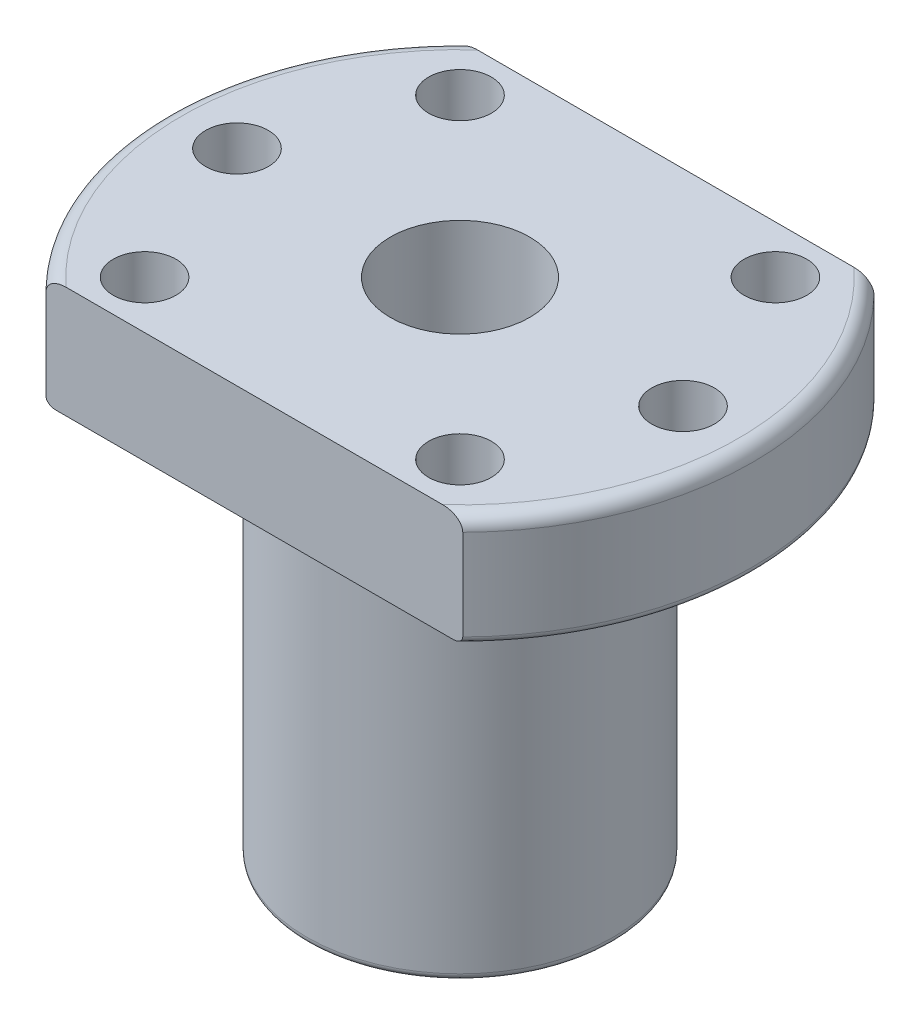
ISO-10303-21;
HEADER;
FILE_DESCRIPTION(('STEP AP214'),'2;1');
FILE_NAME('part.step','',(''),(''),'','','');
FILE_SCHEMA(('AUTOMOTIVE_DESIGN { 1 0 10303 214 1 1 1 1 }'));
ENDSEC;
DATA;
#1=APPLICATION_CONTEXT('core data for automotive mechanical design processes');
#2=APPLICATION_PROTOCOL_DEFINITION('international standard','automotive_design',2000,#1);
#3=PRODUCT_CONTEXT('',#1,'mechanical');
#4=PRODUCT('Part','Part','',(#3));
#5=PRODUCT_RELATED_PRODUCT_CATEGORY('part','',(#4));
#6=PRODUCT_DEFINITION_FORMATION('','',#4);
#7=PRODUCT_DEFINITION_CONTEXT('part definition',#1,'design');
#8=PRODUCT_DEFINITION('design','',#6,#7);
#9=PRODUCT_DEFINITION_SHAPE('','',#8);
#10=(LENGTH_UNIT() NAMED_UNIT(*) SI_UNIT(.MILLI.,.METRE.));
#11=(NAMED_UNIT(*) PLANE_ANGLE_UNIT() SI_UNIT($,.RADIAN.));
#12=(NAMED_UNIT(*) SI_UNIT($,.STERADIAN.) SOLID_ANGLE_UNIT());
#13=UNCERTAINTY_MEASURE_WITH_UNIT(LENGTH_MEASURE(1.E-05),#10,'distance_accuracy_value','');
#14=(GEOMETRIC_REPRESENTATION_CONTEXT(3) GLOBAL_UNCERTAINTY_ASSIGNED_CONTEXT((#13)) GLOBAL_UNIT_ASSIGNED_CONTEXT((#10,
#11,#12)) REPRESENTATION_CONTEXT('',''));
#15=CARTESIAN_POINT('',(0.,0.,0.));
#16=DIRECTION('',(0.,0.,1.));
#17=DIRECTION('',(1.,0.,0.));
#18=AXIS2_PLACEMENT_3D('',#15,#16,#17);
#19=CARTESIAN_POINT('',(0.,0.,0.));
#20=DIRECTION('',(0.,1.,0.));
#21=DIRECTION('',(0.,0.,1.));
#22=AXIS2_PLACEMENT_3D('',#19,#20,#21);
#23=PLANE('',#22);
#24=CARTESIAN_POINT('',(11.3137084989849,0.,11.3137084989846));
#25=DIRECTION('',(0.,1.,0.));
#26=DIRECTION('',(0.,0.,1.));
#27=AXIS2_PLACEMENT_3D('',#24,#25,#26);
#28=CIRCLE('',#27,2.24999999999999);
#29=CARTESIAN_POINT('',(11.3137084989849,0.,13.5637084989846));
#30=VERTEX_POINT('',#29);
#31=EDGE_CURVE('E269',#30,#30,#28,.T.);
#32=ORIENTED_EDGE('',*,*,#31,.T.);
#33=EDGE_LOOP('',(#32));
#34=FACE_BOUND('',#33,.T.);
#35=CARTESIAN_POINT('',(-11.3137084989847,0.,11.3137084989849));
#36=DIRECTION('',(0.,1.,0.));
#37=DIRECTION('',(0.,0.,1.));
#38=AXIS2_PLACEMENT_3D('',#35,#36,#37);
#39=CIRCLE('',#38,2.24999999999999);
#40=CARTESIAN_POINT('',(-11.3137084989847,0.,13.5637084989849));
#41=VERTEX_POINT('',#40);
#42=EDGE_CURVE('E273',#41,#41,#39,.T.);
#43=ORIENTED_EDGE('',*,*,#42,.T.);
#44=EDGE_LOOP('',(#43));
#45=FACE_BOUND('',#44,.T.);
#46=CARTESIAN_POINT('',(-16.,0.,0.));
#47=DIRECTION('',(0.,1.,0.));
#48=DIRECTION('',(0.,0.,1.));
#49=AXIS2_PLACEMENT_3D('',#46,#47,#48);
#50=CIRCLE('',#49,2.24999999999999);
#51=CARTESIAN_POINT('',(-16.,0.,2.24999999999999));
#52=VERTEX_POINT('',#51);
#53=EDGE_CURVE('E159',#52,#52,#50,.T.);
#54=ORIENTED_EDGE('',*,*,#53,.T.);
#55=EDGE_LOOP('',(#54));
#56=FACE_BOUND('',#55,.T.);
#57=CARTESIAN_POINT('',(-11.3137084989848,0.,-11.3137084989847));
#58=DIRECTION('',(0.,1.,0.));
#59=DIRECTION('',(0.,0.,1.));
#60=AXIS2_PLACEMENT_3D('',#57,#58,#59);
#61=CIRCLE('',#60,2.24999999999999);
#62=CARTESIAN_POINT('',(-11.3137084989848,0.,-9.06370849898471));
#63=VERTEX_POINT('',#62);
#64=EDGE_CURVE('E279',#63,#63,#61,.T.);
#65=ORIENTED_EDGE('',*,*,#64,.T.);
#66=EDGE_LOOP('',(#65));
#67=FACE_BOUND('',#66,.T.);
#68=CARTESIAN_POINT('',(11.3137084989847,0.,-11.3137084989848));
#69=DIRECTION('',(0.,1.,0.));
#70=DIRECTION('',(0.,0.,1.));
#71=AXIS2_PLACEMENT_3D('',#68,#69,#70);
#72=CIRCLE('',#71,2.24999999999999);
#73=CARTESIAN_POINT('',(11.3137084989847,0.,-9.06370849898479));
#74=VERTEX_POINT('',#73);
#75=EDGE_CURVE('E283',#74,#74,#72,.T.);
#76=ORIENTED_EDGE('',*,*,#75,.T.);
#77=EDGE_LOOP('',(#76));
#78=FACE_BOUND('',#77,.T.);
#79=CARTESIAN_POINT('',(16.,0.,0.));
#80=DIRECTION('',(0.,1.,0.));
#81=DIRECTION('',(0.,0.,1.));
#82=AXIS2_PLACEMENT_3D('',#79,#80,#81);
#83=CIRCLE('',#82,2.24999999999999);
#84=CARTESIAN_POINT('',(16.,0.,2.24999999999999));
#85=VERTEX_POINT('',#84);
#86=EDGE_CURVE('E154',#85,#85,#83,.T.);
#87=ORIENTED_EDGE('',*,*,#86,.T.);
#88=EDGE_LOOP('',(#87));
#89=FACE_BOUND('',#88,.T.);
#90=DIRECTION('',(-1.,0.,0.));
#91=VECTOR('',#90,1.);
#92=CARTESIAN_POINT('',(-14.9478259288768,0.,-14.75));
#93=LINE('',#92,#91);
#94=CARTESIAN_POINT('',(14.2368360249038,0.,-14.75));
#95=VERTEX_POINT('',#94);
#96=CARTESIAN_POINT('',(-14.2368360249039,0.,-14.75));
#97=VERTEX_POINT('',#96);
#98=EDGE_CURVE('E129',#95,#97,#93,.T.);
#99=ORIENTED_EDGE('',*,*,#98,.F.);
#100=CARTESIAN_POINT('',(0.,0.,0.));
#101=DIRECTION('',(0.,1.,0.));
#102=DIRECTION('',(0.,0.,1.));
#103=AXIS2_PLACEMENT_3D('',#100,#101,#102);
#104=CIRCLE('',#103,20.5);
#105=CARTESIAN_POINT('',(14.2368360249038,0.,14.75));
#106=VERTEX_POINT('',#105);
#107=EDGE_CURVE('E57',#95,#106,#104,.F.);
#108=ORIENTED_EDGE('',*,*,#107,.T.);
#109=DIRECTION('',(1.,0.,0.));
#110=VECTOR('',#109,1.);
#111=CARTESIAN_POINT('',(-14.9478259288767,0.,14.75));
#112=LINE('',#111,#110);
#113=CARTESIAN_POINT('',(-14.2368360249038,0.,14.75));
#114=VERTEX_POINT('',#113);
#115=EDGE_CURVE('E134',#114,#106,#112,.T.);
#116=ORIENTED_EDGE('',*,*,#115,.F.);
#117=CARTESIAN_POINT('',(0.,0.,0.));
#118=DIRECTION('',(0.,1.,0.));
#119=DIRECTION('',(0.,0.,1.));
#120=AXIS2_PLACEMENT_3D('',#117,#118,#119);
#121=CIRCLE('',#120,20.5);
#122=EDGE_CURVE('E469',#114,#97,#121,.F.);
#123=ORIENTED_EDGE('',*,*,#122,.T.);
#124=EDGE_LOOP('',(#99,#108,#116,#123));
#125=FACE_BOUND('',#124,.T.);
#126=CARTESIAN_POINT('',(0.,0.,0.));
#127=DIRECTION('',(0.,1.,0.));
#128=DIRECTION('',(0.,0.,1.));
#129=AXIS2_PLACEMENT_3D('',#126,#127,#128);
#130=CIRCLE('',#129,11.);
#131=CARTESIAN_POINT('',(0.,0.,11.));
#132=VERTEX_POINT('',#131);
#133=EDGE_CURVE('E151',#132,#132,#130,.F.);
#134=ORIENTED_EDGE('',*,*,#133,.F.);
#135=EDGE_LOOP('',(#134));
#136=FACE_BOUND('',#135,.T.);
#137=ADVANCED_FACE('F34',(#34,#45,#56,#67,#78,#89,#125,#136),#23,.F.);
#138=CARTESIAN_POINT('',(0.,8.,0.));
#139=DIRECTION('',(0.,1.,0.));
#140=DIRECTION('',(0.,0.,1.));
#141=AXIS2_PLACEMENT_3D('',#138,#139,#140);
#142=PLANE('',#141);
#143=CARTESIAN_POINT('',(11.3137084989849,8.,11.3137084989846));
#144=DIRECTION('',(0.,1.,0.));
#145=DIRECTION('',(0.,0.,1.));
#146=AXIS2_PLACEMENT_3D('',#143,#144,#145);
#147=CIRCLE('',#146,2.25);
#148=CARTESIAN_POINT('',(11.3137084989849,8.,13.5637084989846));
#149=VERTEX_POINT('',#148);
#150=EDGE_CURVE('E331',#149,#149,#147,.T.);
#151=ORIENTED_EDGE('',*,*,#150,.F.);
#152=EDGE_LOOP('',(#151));
#153=FACE_BOUND('',#152,.T.);
#154=CARTESIAN_POINT('',(-11.3137084989847,8.,11.3137084989849));
#155=DIRECTION('',(0.,1.,0.));
#156=DIRECTION('',(0.,0.,1.));
#157=AXIS2_PLACEMENT_3D('',#154,#155,#156);
#158=CIRCLE('',#157,2.25);
#159=CARTESIAN_POINT('',(-11.3137084989847,8.,13.5637084989849));
#160=VERTEX_POINT('',#159);
#161=EDGE_CURVE('E327',#160,#160,#158,.T.);
#162=ORIENTED_EDGE('',*,*,#161,.F.);
#163=EDGE_LOOP('',(#162));
#164=FACE_BOUND('',#163,.T.);
#165=CARTESIAN_POINT('',(-16.,8.,0.));
#166=DIRECTION('',(0.,1.,0.));
#167=DIRECTION('',(0.,0.,1.));
#168=AXIS2_PLACEMENT_3D('',#165,#166,#167);
#169=CIRCLE('',#168,2.25);
#170=CARTESIAN_POINT('',(-16.,8.,2.25));
#171=VERTEX_POINT('',#170);
#172=EDGE_CURVE('E163',#171,#171,#169,.T.);
#173=ORIENTED_EDGE('',*,*,#172,.F.);
#174=EDGE_LOOP('',(#173));
#175=FACE_BOUND('',#174,.T.);
#176=CARTESIAN_POINT('',(-11.3137084989848,8.,-11.3137084989847));
#177=DIRECTION('',(0.,1.,0.));
#178=DIRECTION('',(0.,0.,1.));
#179=AXIS2_PLACEMENT_3D('',#176,#177,#178);
#180=CIRCLE('',#179,2.25);
#181=CARTESIAN_POINT('',(-11.3137084989848,8.,-9.0637084989847));
#182=VERTEX_POINT('',#181);
#183=EDGE_CURVE('E162',#182,#182,#180,.T.);
#184=ORIENTED_EDGE('',*,*,#183,.F.);
#185=EDGE_LOOP('',(#184));
#186=FACE_BOUND('',#185,.T.);
#187=CARTESIAN_POINT('',(11.3137084989847,8.,-11.3137084989848));
#188=DIRECTION('',(0.,1.,0.));
#189=DIRECTION('',(0.,0.,1.));
#190=AXIS2_PLACEMENT_3D('',#187,#188,#189);
#191=CIRCLE('',#190,2.25);
#192=CARTESIAN_POINT('',(11.3137084989847,8.,-9.06370849898479));
#193=VERTEX_POINT('',#192);
#194=EDGE_CURVE('E318',#193,#193,#191,.T.);
#195=ORIENTED_EDGE('',*,*,#194,.F.);
#196=EDGE_LOOP('',(#195));
#197=FACE_BOUND('',#196,.T.);
#198=CARTESIAN_POINT('',(16.,8.,0.));
#199=DIRECTION('',(0.,1.,0.));
#200=DIRECTION('',(0.,0.,1.));
#201=AXIS2_PLACEMENT_3D('',#198,#199,#200);
#202=CIRCLE('',#201,2.25);
#203=CARTESIAN_POINT('',(16.,8.,2.25));
#204=VERTEX_POINT('',#203);
#205=EDGE_CURVE('E158',#204,#204,#202,.T.);
#206=ORIENTED_EDGE('',*,*,#205,.F.);
#207=EDGE_LOOP('',(#206));
#208=FACE_BOUND('',#207,.T.);
#209=DIRECTION('',(-1.,0.,0.));
#210=VECTOR('',#209,1.);
#211=CARTESIAN_POINT('',(-14.9478259288768,8.,-14.75));
#212=LINE('',#211,#210);
#213=CARTESIAN_POINT('',(13.5069426592401,8.,-14.75));
#214=VERTEX_POINT('',#213);
#215=CARTESIAN_POINT('',(-13.5069426592401,8.,-14.75));
#216=VERTEX_POINT('',#215);
#217=EDGE_CURVE('E123',#214,#216,#212,.T.);
#218=ORIENTED_EDGE('',*,*,#217,.T.);
#219=CARTESIAN_POINT('',(0.,8.,0.));
#220=DIRECTION('',(0.,1.,0.));
#221=DIRECTION('',(0.,0.,1.));
#222=AXIS2_PLACEMENT_3D('',#219,#220,#221);
#223=CIRCLE('',#222,20.);
#224=CARTESIAN_POINT('',(-13.5069426592401,8.,14.75));
#225=VERTEX_POINT('',#224);
#226=EDGE_CURVE('E106',#216,#225,#223,.T.);
#227=ORIENTED_EDGE('',*,*,#226,.T.);
#228=DIRECTION('',(1.,0.,0.));
#229=VECTOR('',#228,1.);
#230=CARTESIAN_POINT('',(-14.9478259288767,8.,14.75));
#231=LINE('',#230,#229);
#232=CARTESIAN_POINT('',(13.5069426592401,8.,14.75));
#233=VERTEX_POINT('',#232);
#234=EDGE_CURVE('E120',#225,#233,#231,.T.);
#235=ORIENTED_EDGE('',*,*,#234,.T.);
#236=CARTESIAN_POINT('',(0.,8.,0.));
#237=DIRECTION('',(0.,1.,0.));
#238=DIRECTION('',(0.,0.,1.));
#239=AXIS2_PLACEMENT_3D('',#236,#237,#238);
#240=CIRCLE('',#239,20.);
#241=EDGE_CURVE('E124',#233,#214,#240,.T.);
#242=ORIENTED_EDGE('',*,*,#241,.T.);
#243=EDGE_LOOP('',(#218,#227,#235,#242));
#244=FACE_BOUND('',#243,.T.);
#245=CARTESIAN_POINT('',(0.,8.,0.));
#246=DIRECTION('',(0.,1.,0.));
#247=DIRECTION('',(0.,0.,1.));
#248=AXIS2_PLACEMENT_3D('',#245,#246,#247);
#249=CIRCLE('',#248,5.);
#250=CARTESIAN_POINT('',(0.,8.,5.));
#251=VERTEX_POINT('',#250);
#252=EDGE_CURVE('E137',#251,#251,#249,.T.);
#253=ORIENTED_EDGE('',*,*,#252,.F.);
#254=EDGE_LOOP('',(#253));
#255=FACE_BOUND('',#254,.T.);
#256=ADVANCED_FACE('F117',(#153,#164,#175,#186,#197,#208,#244,#255),#142,.T.);
#257=CARTESIAN_POINT('',(0.,8.,0.));
#258=DIRECTION('',(0.,-1.,0.));
#259=DIRECTION('',(0.,0.,-1.));
#260=AXIS2_PLACEMENT_3D('',#257,#258,#259);
#261=CYLINDRICAL_SURFACE('',#260,21.);
#262=DIRECTION('',(0.,-1.,0.));
#263=VECTOR('',#262,1.);
#264=CARTESIAN_POINT('',(-14.9478259288768,8.,-14.75));
#265=LINE('',#264,#263);
#266=CARTESIAN_POINT('',(-14.9478259288768,7.,-14.75));
#267=VERTEX_POINT('',#266);
#268=CARTESIAN_POINT('',(-14.9478259288768,0.5,-14.75));
#269=VERTEX_POINT('',#268);
#270=EDGE_CURVE('E131',#267,#269,#265,.T.);
#271=ORIENTED_EDGE('',*,*,#270,.T.);
#272=CARTESIAN_POINT('',(0.,0.5,0.));
#273=DIRECTION('',(0.,1.,0.));
#274=DIRECTION('',(0.,0.,1.));
#275=AXIS2_PLACEMENT_3D('',#272,#273,#274);
#276=CIRCLE('',#275,21.);
#277=CARTESIAN_POINT('',(-14.9478259288767,0.5,14.75));
#278=VERTEX_POINT('',#277);
#279=EDGE_CURVE('E463',#269,#278,#276,.T.);
#280=ORIENTED_EDGE('',*,*,#279,.T.);
#281=DIRECTION('',(0.,-1.,0.));
#282=VECTOR('',#281,1.);
#283=CARTESIAN_POINT('',(-14.9478259288767,8.,14.75));
#284=LINE('',#283,#282);
#285=CARTESIAN_POINT('',(-14.9478259288767,7.,14.75));
#286=VERTEX_POINT('',#285);
#287=EDGE_CURVE('E149',#286,#278,#284,.T.);
#288=ORIENTED_EDGE('',*,*,#287,.F.);
#289=CARTESIAN_POINT('',(0.,7.,0.));
#290=DIRECTION('',(0.,1.,0.));
#291=DIRECTION('',(0.,0.,1.));
#292=AXIS2_PLACEMENT_3D('',#289,#290,#291);
#293=CIRCLE('',#292,21.);
#294=EDGE_CURVE('E107',#286,#267,#293,.F.);
#295=ORIENTED_EDGE('',*,*,#294,.T.);
#296=EDGE_LOOP('',(#271,#280,#288,#295));
#297=FACE_BOUND('',#296,.T.);
#298=ADVANCED_FACE('F185',(#297),#261,.T.);
#299=CARTESIAN_POINT('',(-14.9478259288767,8.,14.75));
#300=DIRECTION('',(0.,0.,-1.));
#301=DIRECTION('',(-1.,0.,0.));
#302=AXIS2_PLACEMENT_3D('',#299,#300,#301);
#303=PLANE('',#302);
#304=ORIENTED_EDGE('',*,*,#115,.T.);
#305=CARTESIAN_POINT('',(14.2368360249038,0.,14.75));
#306=CARTESIAN_POINT('',(14.2645280876522,7.74826244398505E-06,14.75));
#307=CARTESIAN_POINT('',(14.2922022325556,0.00110980537690282,14.75));
#308=CARTESIAN_POINT('',(14.3474137356424,0.00557318697840979,14.75));
#309=CARTESIAN_POINT('',(14.3749507835145,0.00893832747370448,14.75));
#310=CARTESIAN_POINT('',(14.4575537275548,0.0226104335168016,14.75));
#311=CARTESIAN_POINT('',(14.5121091205638,0.0364967933773837,14.75));
#312=CARTESIAN_POINT('',(14.6000347039378,0.0683399200607381,14.75));
#313=CARTESIAN_POINT('',(14.6344555545674,0.0834417867983814,14.75));
#314=CARTESIAN_POINT('',(14.7005566072333,0.118665610743979,14.75));
#315=CARTESIAN_POINT('',(14.7322461478623,0.13876946779952,14.75));
#316=CARTESIAN_POINT('',(14.7841864591707,0.17872568126033,14.75));
#317=CARTESIAN_POINT('',(14.8053296822602,0.197414614826338,14.75));
#318=CARTESIAN_POINT('',(14.8444138601702,0.237918320870485,14.75));
#319=CARTESIAN_POINT('',(14.8623577217982,0.259730223119138,14.75));
#320=CARTESIAN_POINT('',(14.8907827020407,0.301634018545011,14.75));
#321=CARTESIAN_POINT('',(14.9020385678448,0.321198578252392,14.75));
#322=CARTESIAN_POINT('',(14.9211610002851,0.361902253860436,14.75));
#323=CARTESIAN_POINT('',(14.929034829091,0.383037880518841,14.75));
#324=CARTESIAN_POINT('',(14.9391725212027,0.420189491291733,14.75));
#325=CARTESIAN_POINT('',(14.9423957699318,0.435947232752129,14.75));
#326=CARTESIAN_POINT('',(14.9467323883287,0.467797314996761,14.75));
#327=CARTESIAN_POINT('',(14.9478393494616,0.483890523374978,14.75));
#328=CARTESIAN_POINT('',(14.9478259288767,0.500000000000001,14.75));
#329=B_SPLINE_CURVE_WITH_KNOTS('',3,(#305,#306,#307,#308,#309,#310,#311,#312,#313,#314,#315,
#316,#317,#318,#319,#320,#321,#322,#323,#324,#325,#326,#327,#328),.UNSPECIFIED.,.F.,.F.,(4,2,2,
2,2,2,2,2,2,2,2,4),(0.,0.0830158471083474,0.166172027581731,0.333974109747401,0.446408589747027,
0.558441986547342,0.642814394827929,0.727109750806298,0.794559771043547,0.861864224438678,
0.909981085784283,0.958243425070669),.UNSPECIFIED.);
#330=CARTESIAN_POINT('',(14.9478259288767,0.5,14.75));
#331=VERTEX_POINT('',#330);
#332=EDGE_CURVE('E197',#106,#331,#329,.T.);
#333=ORIENTED_EDGE('',*,*,#332,.T.);
#334=DIRECTION('',(0.,-1.,0.));
#335=VECTOR('',#334,1.);
#336=CARTESIAN_POINT('',(14.9478259288767,8.,14.75));
#337=LINE('',#336,#335);
#338=CARTESIAN_POINT('',(14.9478259288767,7.,14.75));
#339=VERTEX_POINT('',#338);
#340=EDGE_CURVE('E146',#339,#331,#337,.T.);
#341=ORIENTED_EDGE('',*,*,#340,.F.);
#342=CARTESIAN_POINT('',(14.9478259288767,7.,14.75));
#343=CARTESIAN_POINT('',(14.9478298476048,7.02242540324757,14.75));
#344=CARTESIAN_POINT('',(14.9467652310037,7.04483718625379,14.75));
#345=CARTESIAN_POINT('',(14.9425458142488,7.08944714242369,14.75));
#346=CARTESIAN_POINT('',(14.9393925337539,7.11164545899603,14.75));
#347=CARTESIAN_POINT('',(14.92694266166,7.17729404582295,14.75));
#348=CARTESIAN_POINT('',(14.9146541231529,7.22020712417751,14.75));
#349=CARTESIAN_POINT('',(14.8830123298779,7.30314928694122,14.75));
#350=CARTESIAN_POINT('',(14.8636770700731,7.34318540910178,14.75));
#351=CARTESIAN_POINT('',(14.8190645113758,7.41986373687077,14.75));
#352=CARTESIAN_POINT('',(14.7937745239565,7.45649845895782,14.75));
#353=CARTESIAN_POINT('',(14.7275887206947,7.53952915307985,14.75));
#354=CARTESIAN_POINT('',(14.6844573889568,7.58414100073959,14.75));
#355=CARTESIAN_POINT('',(14.5916159692135,7.66584381587117,14.75));
#356=CARTESIAN_POINT('',(14.5418951764486,7.70292229146545,14.75));
#357=CARTESIAN_POINT('',(14.4172064658566,7.78319762733565,14.75));
#358=CARTESIAN_POINT('',(14.3400492268914,7.82298394054636,14.75));
#359=CARTESIAN_POINT('',(14.1803588479982,7.88990942831022,14.75));
#360=CARTESIAN_POINT('',(14.0978108317088,7.91701176099371,14.75));
#361=CARTESIAN_POINT('',(13.9307348511282,7.95940979208388,14.75));
#362=CARTESIAN_POINT('',(13.8462386455535,7.97483205744163,14.75));
#363=CARTESIAN_POINT('',(13.7189857764266,7.99003984536936,14.75));
#364=CARTESIAN_POINT('',(13.676656501993,7.99378878567431,14.75));
#365=CARTESIAN_POINT('',(13.5918687310867,7.99876611643036,14.75));
#366=CARTESIAN_POINT('',(13.5494103026378,7.99999565992158,14.75));
#367=CARTESIAN_POINT('',(13.5069426592401,8.,14.75));
#368=B_SPLINE_CURVE_WITH_KNOTS('',3,(#342,#343,#344,#345,#346,#347,#348,#349,#350,#351,#352,
#353,#354,#355,#356,#357,#358,#359,#360,#361,#362,#363,#364,#365,#366,#367),.UNSPECIFIED.,.F.,
.F.,(4,2,2,2,2,2,2,2,2,2,2,2,4),(0.,0.0672251103148741,0.134401362986036,0.267545420235376,
0.4003518276773,0.533443826017013,0.718574937751304,0.90401057347758,1.16302951375484,
1.42279620089204,1.67970607185475,1.80712904910128,1.93449369625466),.UNSPECIFIED.);
#369=EDGE_CURVE('E112',#339,#233,#368,.T.);
#370=ORIENTED_EDGE('',*,*,#369,.T.);
#371=ORIENTED_EDGE('',*,*,#234,.F.);
#372=CARTESIAN_POINT('',(-13.5069426592401,8.,14.75));
#373=CARTESIAN_POINT('',(-13.5645457829032,7.99998715854758,14.75));
#374=CARTESIAN_POINT('',(-13.6221657253092,7.99772872969722,14.75));
#375=CARTESIAN_POINT('',(-13.7371490361235,7.9885243489197,14.75));
#376=CARTESIAN_POINT('',(-13.794511609919,7.98156854717799,14.75));
#377=CARTESIAN_POINT('',(-13.9090857202748,7.9626656888973,14.75));
#378=CARTESIAN_POINT('',(-13.9662882807676,7.9506633042786,14.75));
#379=CARTESIAN_POINT('',(-14.0792763592951,7.92139175471893,14.75));
#380=CARTESIAN_POINT('',(-14.1350632165867,7.90412778502228,14.75));
#381=CARTESIAN_POINT('',(-14.258979270878,7.85871044037686,14.75));
#382=CARTESIAN_POINT('',(-14.3265120504576,7.82888903530641,14.75));
#383=CARTESIAN_POINT('',(-14.4562258644666,7.75956681936739,14.75));
#384=CARTESIAN_POINT('',(-14.5184256598934,7.72010199409377,14.75));
#385=CARTESIAN_POINT('',(-14.6212270415216,7.6412070615916,14.75));
#386=CARTESIAN_POINT('',(-14.6634752037993,7.60393367062402,14.75));
#387=CARTESIAN_POINT('',(-14.741554046878,7.52311377766061,14.75));
#388=CARTESIAN_POINT('',(-14.7773902718622,7.47957275444242,14.75));
#389=CARTESIAN_POINT('',(-14.8341075959526,7.39594360125545,14.75));
#390=CARTESIAN_POINT('',(-14.8565466583308,7.35691559951152,14.75));
#391=CARTESIAN_POINT('',(-14.8946603780237,7.27571920797203,14.75));
#392=CARTESIAN_POINT('',(-14.9103493144342,7.233557670742,14.75));
#393=CARTESIAN_POINT('',(-14.9305637774342,7.15940815478796,14.75));
#394=CARTESIAN_POINT('',(-14.9369944546954,7.12793237915329,14.75));
#395=CARTESIAN_POINT('',(-14.94564492619,7.06431617992761,14.75));
#396=CARTESIAN_POINT('',(-14.9478522653234,7.03217407213302,14.75));
#397=CARTESIAN_POINT('',(-14.9478259288767,7.,14.75));
#398=B_SPLINE_CURVE_WITH_KNOTS('',3,(#372,#373,#374,#375,#376,#377,#378,#379,#380,#381,#382,
#383,#384,#385,#386,#387,#388,#389,#390,#391,#392,#393,#394,#395,#396,#397),.UNSPECIFIED.,.F.,
.F.,(4,2,2,2,2,2,2,2,2,2,2,2,4),(0.,0.172790892229479,0.345945235423933,0.521049599527172,
0.695981624160525,0.916752854167091,1.13671250407887,1.30515503175622,1.47345120156766,
1.60797908984682,1.74222098409019,1.83832928652366,1.9347205889127),.UNSPECIFIED.);
#399=EDGE_CURVE('E102',#225,#286,#398,.T.);
#400=ORIENTED_EDGE('',*,*,#399,.T.);
#401=ORIENTED_EDGE('',*,*,#287,.T.);
#402=CARTESIAN_POINT('',(-14.9478259288767,0.5,14.75));
#403=CARTESIAN_POINT('',(-14.9478782394663,0.477514699312037,14.75));
#404=CARTESIAN_POINT('',(-14.9456987839229,0.4550840133347,14.75));
#405=CARTESIAN_POINT('',(-14.9373299323952,0.41117011561819,14.75));
#406=CARTESIAN_POINT('',(-14.9311743502149,0.389680531116249,14.75));
#407=CARTESIAN_POINT('',(-14.9153142311511,0.348142216544868,14.75));
#408=CARTESIAN_POINT('',(-14.9056190142238,0.328089866576074,14.75));
#409=CARTESIAN_POINT('',(-14.883263040905,0.289682488404593,14.75));
#410=CARTESIAN_POINT('',(-14.8705958309165,0.2713312769081,14.75));
#411=CARTESIAN_POINT('',(-14.8373778981263,0.229633203227506,14.75));
#412=CARTESIAN_POINT('',(-14.8156928027744,0.207190599455815,14.75));
#413=CARTESIAN_POINT('',(-14.7690135828456,0.1660831178628,14.75));
#414=CARTESIAN_POINT('',(-14.7440138713061,0.147424755964167,14.75));
#415=CARTESIAN_POINT('',(-14.6815666077257,0.107195125617478,14.75));
#416=CARTESIAN_POINT('',(-14.6430469559757,0.0872927311067714,14.75));
#417=CARTESIAN_POINT('',(-14.5633137826947,0.0538321417335413,14.75));
#418=CARTESIAN_POINT('',(-14.522093678549,0.0402901603860508,14.75));
#419=CARTESIAN_POINT('',(-14.440280832887,0.0196052230934304,14.75));
#420=CARTESIAN_POINT('',(-14.3997582243009,0.0121784217414867,14.75));
#421=CARTESIAN_POINT('',(-14.3184193906496,0.00240850676684448,14.75));
#422=CARTESIAN_POINT('',(-14.2776079324512,2.61318215139728E-05,14.75));
#423=CARTESIAN_POINT('',(-14.2368360249038,0.,14.75));
#424=B_SPLINE_CURVE_WITH_KNOTS('',3,(#402,#403,#404,#405,#406,#407,#408,#409,#410,#411,#412,
#413,#414,#415,#416,#417,#418,#419,#420,#421,#422,#423),.UNSPECIFIED.,.F.,.F.,(4,2,2,2,2,2,2,2,
2,2,4),(0.,0.0672639152780453,0.133963203936258,0.200488123377202,0.267158859034716,
0.360264532035505,0.453529183527509,0.582901203195317,0.712601242590042,0.835874080662489,
0.958183891669046),.UNSPECIFIED.);
#425=EDGE_CURVE('E49',#278,#114,#424,.T.);
#426=ORIENTED_EDGE('',*,*,#425,.T.);
#427=EDGE_LOOP('',(#304,#333,#341,#370,#371,#400,#401,#426));
#428=FACE_BOUND('',#427,.T.);
#429=ADVANCED_FACE('F126',(#428),#303,.F.);
#430=CARTESIAN_POINT('',(0.,8.,0.));
#431=DIRECTION('',(0.,-1.,0.));
#432=DIRECTION('',(0.,0.,-1.));
#433=AXIS2_PLACEMENT_3D('',#430,#431,#432);
#434=CYLINDRICAL_SURFACE('',#433,21.);
#435=ORIENTED_EDGE('',*,*,#340,.T.);
#436=CARTESIAN_POINT('',(0.,0.5,0.));
#437=DIRECTION('',(0.,1.,0.));
#438=DIRECTION('',(0.,0.,1.));
#439=AXIS2_PLACEMENT_3D('',#436,#437,#438);
#440=CIRCLE('',#439,21.);
#441=CARTESIAN_POINT('',(14.9478259288767,0.5,-14.75));
#442=VERTEX_POINT('',#441);
#443=EDGE_CURVE('E219',#331,#442,#440,.T.);
#444=ORIENTED_EDGE('',*,*,#443,.T.);
#445=DIRECTION('',(0.,-1.,0.));
#446=VECTOR('',#445,1.);
#447=CARTESIAN_POINT('',(14.9478259288767,8.,-14.75));
#448=LINE('',#447,#446);
#449=CARTESIAN_POINT('',(14.9478259288767,7.,-14.75));
#450=VERTEX_POINT('',#449);
#451=EDGE_CURVE('E143',#450,#442,#448,.T.);
#452=ORIENTED_EDGE('',*,*,#451,.F.);
#453=CARTESIAN_POINT('',(0.,7.,0.));
#454=DIRECTION('',(0.,1.,0.));
#455=DIRECTION('',(0.,0.,1.));
#456=AXIS2_PLACEMENT_3D('',#453,#454,#455);
#457=CIRCLE('',#456,21.);
#458=EDGE_CURVE('E247',#450,#339,#457,.F.);
#459=ORIENTED_EDGE('',*,*,#458,.T.);
#460=EDGE_LOOP('',(#435,#444,#452,#459));
#461=FACE_BOUND('',#460,.T.);
#462=ADVANCED_FACE('F184',(#461),#434,.T.);
#463=CARTESIAN_POINT('',(-14.9478259288768,8.,-14.75));
#464=DIRECTION('',(0.,0.,1.));
#465=DIRECTION('',(1.,0.,0.));
#466=AXIS2_PLACEMENT_3D('',#463,#464,#465);
#467=PLANE('',#466);
#468=ORIENTED_EDGE('',*,*,#451,.T.);
#469=CARTESIAN_POINT('',(14.9478259288767,0.5,-14.75));
#470=CARTESIAN_POINT('',(14.9478782394663,0.477514699312038,-14.75));
#471=CARTESIAN_POINT('',(14.9456987839229,0.455084013334701,-14.75));
#472=CARTESIAN_POINT('',(14.9373299323952,0.411170115618191,-14.75));
#473=CARTESIAN_POINT('',(14.9311743502149,0.389680531116249,-14.75));
#474=CARTESIAN_POINT('',(14.9153142311511,0.348142216544868,-14.75));
#475=CARTESIAN_POINT('',(14.9056190142238,0.328089866576075,-14.75));
#476=CARTESIAN_POINT('',(14.883263040905,0.289682488404595,-14.75));
#477=CARTESIAN_POINT('',(14.8705958309165,0.271331276908103,-14.75));
#478=CARTESIAN_POINT('',(14.8373778981262,0.229633203227509,-14.75));
#479=CARTESIAN_POINT('',(14.8156928027744,0.207190599455816,-14.75));
#480=CARTESIAN_POINT('',(14.7690135828456,0.166083117862799,-14.75));
#481=CARTESIAN_POINT('',(14.7440138713061,0.147424755964167,-14.75));
#482=CARTESIAN_POINT('',(14.6815666077257,0.10719512561748,-14.75));
#483=CARTESIAN_POINT('',(14.6430469559757,0.0872927311067735,-14.75));
#484=CARTESIAN_POINT('',(14.5633137826947,0.0538321417335425,-14.75));
#485=CARTESIAN_POINT('',(14.522093678549,0.040290160386051,-14.75));
#486=CARTESIAN_POINT('',(14.440280832887,0.0196052230934301,-14.75));
#487=CARTESIAN_POINT('',(14.3997582243009,0.0121784217414867,-14.75));
#488=CARTESIAN_POINT('',(14.3184193906496,0.00240850676684491,-14.75));
#489=CARTESIAN_POINT('',(14.2776079324512,2.61318215145261E-05,-14.75));
#490=CARTESIAN_POINT('',(14.2368360249038,0.,-14.75));
#491=B_SPLINE_CURVE_WITH_KNOTS('',3,(#469,#470,#471,#472,#473,#474,#475,#476,#477,#478,#479,
#480,#481,#482,#483,#484,#485,#486,#487,#488,#489,#490),.UNSPECIFIED.,.F.,.F.,(4,2,2,2,2,2,2,2,
2,2,4),(0.,0.0672639152780451,0.133963203936257,0.200488123377199,0.267158859034716,
0.360264532035503,0.453529183527508,0.582901203195316,0.712601242590043,0.83587408066249,
0.958183891669047),.UNSPECIFIED.);
#492=EDGE_CURVE('E218',#442,#95,#491,.T.);
#493=ORIENTED_EDGE('',*,*,#492,.T.);
#494=ORIENTED_EDGE('',*,*,#98,.T.);
#495=CARTESIAN_POINT('',(-14.2368360249039,0.,-14.75));
#496=CARTESIAN_POINT('',(-14.2645280876522,7.74826244343479E-06,-14.75));
#497=CARTESIAN_POINT('',(-14.2922022325556,0.00110980537690221,-14.75));
#498=CARTESIAN_POINT('',(-14.3474137356424,0.00557318697840933,-14.75));
#499=CARTESIAN_POINT('',(-14.3749507835145,0.00893832747370437,-14.75));
#500=CARTESIAN_POINT('',(-14.4575537275548,0.0226104335168015,-14.75));
#501=CARTESIAN_POINT('',(-14.5121091205638,0.0364967933773822,-14.75));
#502=CARTESIAN_POINT('',(-14.6000347039378,0.0683399200607368,-14.75));
#503=CARTESIAN_POINT('',(-14.6344555545675,0.0834417867983814,-14.75));
#504=CARTESIAN_POINT('',(-14.7005566072333,0.118665610743979,-14.75));
#505=CARTESIAN_POINT('',(-14.7322461478623,0.138769467799517,-14.75));
#506=CARTESIAN_POINT('',(-14.7841864591707,0.178725681260328,-14.75));
#507=CARTESIAN_POINT('',(-14.8053296822602,0.197414614826338,-14.75));
#508=CARTESIAN_POINT('',(-14.8444138601702,0.237918320870483,-14.75));
#509=CARTESIAN_POINT('',(-14.8623577217982,0.259730223119134,-14.75));
#510=CARTESIAN_POINT('',(-14.8907827020407,0.301634018545005,-14.75));
#511=CARTESIAN_POINT('',(-14.9020385678449,0.321198578252387,-14.75));
#512=CARTESIAN_POINT('',(-14.9211610002851,0.361902253860432,-14.75));
#513=CARTESIAN_POINT('',(-14.929034829091,0.383037880518838,-14.75));
#514=CARTESIAN_POINT('',(-14.9391725212027,0.42018949129173,-14.75));
#515=CARTESIAN_POINT('',(-14.9423957699318,0.435947232752127,-14.75));
#516=CARTESIAN_POINT('',(-14.9467323883287,0.46779731499676,-14.75));
#517=CARTESIAN_POINT('',(-14.9478393494616,0.483890523374978,-14.75));
#518=CARTESIAN_POINT('',(-14.9478259288768,0.5,-14.75));
#519=B_SPLINE_CURVE_WITH_KNOTS('',3,(#495,#496,#497,#498,#499,#500,#501,#502,#503,#504,#505,
#506,#507,#508,#509,#510,#511,#512,#513,#514,#515,#516,#517,#518),.UNSPECIFIED.,.F.,.F.,(4,2,2,
2,2,2,2,2,2,2,2,4),(0.,0.0830158471083439,0.166172027581729,0.333974109747396,0.446408589747026,
0.558441986547341,0.642814394827928,0.727109750806295,0.794559771043544,0.861864224438675,
0.909981085784282,0.958243425070669),.UNSPECIFIED.);
#520=EDGE_CURVE('E211',#97,#269,#519,.T.);
#521=ORIENTED_EDGE('',*,*,#520,.T.);
#522=ORIENTED_EDGE('',*,*,#270,.F.);
#523=CARTESIAN_POINT('',(-14.9478259288768,7.,-14.75));
#524=CARTESIAN_POINT('',(-14.9478298476048,7.02242540324757,-14.75));
#525=CARTESIAN_POINT('',(-14.9467652310037,7.04483718625379,-14.75));
#526=CARTESIAN_POINT('',(-14.9425458142488,7.08944714242369,-14.75));
#527=CARTESIAN_POINT('',(-14.939392533754,7.11164545899603,-14.75));
#528=CARTESIAN_POINT('',(-14.92694266166,7.17729404582295,-14.75));
#529=CARTESIAN_POINT('',(-14.914654123153,7.22020712417751,-14.75));
#530=CARTESIAN_POINT('',(-14.8830123298779,7.30314928694122,-14.75));
#531=CARTESIAN_POINT('',(-14.8636770700731,7.34318540910177,-14.75));
#532=CARTESIAN_POINT('',(-14.8190645113758,7.41986373687077,-14.75));
#533=CARTESIAN_POINT('',(-14.7937745239565,7.45649845895782,-14.75));
#534=CARTESIAN_POINT('',(-14.7275887206947,7.53952915307985,-14.75));
#535=CARTESIAN_POINT('',(-14.6844573889569,7.58414100073959,-14.75));
#536=CARTESIAN_POINT('',(-14.5916159692135,7.66584381587117,-14.75));
#537=CARTESIAN_POINT('',(-14.5418951764486,7.70292229146544,-14.75));
#538=CARTESIAN_POINT('',(-14.4172064658566,7.78319762733565,-14.75));
#539=CARTESIAN_POINT('',(-14.3400492268915,7.82298394054635,-14.75));
#540=CARTESIAN_POINT('',(-14.1803588479982,7.88990942831022,-14.75));
#541=CARTESIAN_POINT('',(-14.0978108317088,7.91701176099371,-14.75));
#542=CARTESIAN_POINT('',(-13.9307348511282,7.95940979208388,-14.75));
#543=CARTESIAN_POINT('',(-13.8462386455535,7.97483205744163,-14.75));
#544=CARTESIAN_POINT('',(-13.7189857764266,7.99003984536936,-14.75));
#545=CARTESIAN_POINT('',(-13.676656501993,7.99378878567431,-14.75));
#546=CARTESIAN_POINT('',(-13.5918687310867,7.99876611643036,-14.75));
#547=CARTESIAN_POINT('',(-13.5494103026378,7.99999565992158,-14.75));
#548=CARTESIAN_POINT('',(-13.5069426592401,8.,-14.75));
#549=B_SPLINE_CURVE_WITH_KNOTS('',3,(#523,#524,#525,#526,#527,#528,#529,#530,#531,#532,#533,
#534,#535,#536,#537,#538,#539,#540,#541,#542,#543,#544,#545,#546,#547,#548),.UNSPECIFIED.,.F.,
.F.,(4,2,2,2,2,2,2,2,2,2,2,2,4),(0.,0.0672251103148747,0.134401362986036,0.267545420235376,
0.400351827677299,0.533443826017013,0.718574937751299,0.904010573477576,1.16302951375483,
1.42279620089204,1.67970607185475,1.80712904910128,1.93449369625466),.UNSPECIFIED.);
#550=EDGE_CURVE('E242',#267,#216,#549,.T.);
#551=ORIENTED_EDGE('',*,*,#550,.T.);
#552=ORIENTED_EDGE('',*,*,#217,.F.);
#553=CARTESIAN_POINT('',(13.5069426592401,8.,-14.75));
#554=CARTESIAN_POINT('',(13.5645457829032,7.99998715854758,-14.75));
#555=CARTESIAN_POINT('',(13.6221657253092,7.99772872969722,-14.75));
#556=CARTESIAN_POINT('',(13.7371490361235,7.9885243489197,-14.75));
#557=CARTESIAN_POINT('',(13.794511609919,7.98156854717799,-14.75));
#558=CARTESIAN_POINT('',(13.9090857202748,7.9626656888973,-14.75));
#559=CARTESIAN_POINT('',(13.9662882807676,7.9506633042786,-14.75));
#560=CARTESIAN_POINT('',(14.0792763592951,7.92139175471893,-14.75));
#561=CARTESIAN_POINT('',(14.1350632165867,7.90412778502228,-14.75));
#562=CARTESIAN_POINT('',(14.2589792708779,7.85871044037686,-14.75));
#563=CARTESIAN_POINT('',(14.3265120504575,7.82888903530641,-14.75));
#564=CARTESIAN_POINT('',(14.4562258644666,7.75956681936739,-14.75));
#565=CARTESIAN_POINT('',(14.5184256598934,7.72010199409378,-14.75));
#566=CARTESIAN_POINT('',(14.6212270415216,7.6412070615916,-14.75));
#567=CARTESIAN_POINT('',(14.6634752037993,7.60393367062402,-14.75));
#568=CARTESIAN_POINT('',(14.7415540468779,7.52311377766062,-14.75));
#569=CARTESIAN_POINT('',(14.7773902718622,7.47957275444243,-14.75));
#570=CARTESIAN_POINT('',(14.8341075959526,7.39594360125546,-14.75));
#571=CARTESIAN_POINT('',(14.8565466583308,7.35691559951154,-14.75));
#572=CARTESIAN_POINT('',(14.8946603780236,7.27571920797204,-14.75));
#573=CARTESIAN_POINT('',(14.9103493144342,7.233557670742,-14.75));
#574=CARTESIAN_POINT('',(14.9305637774341,7.15940815478797,-14.75));
#575=CARTESIAN_POINT('',(14.9369944546954,7.1279323791533,-14.75));
#576=CARTESIAN_POINT('',(14.94564492619,7.06431617992762,-14.75));
#577=CARTESIAN_POINT('',(14.9478522653234,7.03217407213302,-14.75));
#578=CARTESIAN_POINT('',(14.9478259288767,7.,-14.75));
#579=B_SPLINE_CURVE_WITH_KNOTS('',3,(#553,#554,#555,#556,#557,#558,#559,#560,#561,#562,#563,
#564,#565,#566,#567,#568,#569,#570,#571,#572,#573,#574,#575,#576,#577,#578),.UNSPECIFIED.,.F.,
.F.,(4,2,2,2,2,2,2,2,2,2,2,2,4),(0.,0.172790892229479,0.345945235423931,0.521049599527164,
0.695981624160512,0.916752854167078,1.13671250407886,1.30515503175621,1.47345120156765,
1.60797908984681,1.74222098409018,1.83832928652365,1.9347205889127),.UNSPECIFIED.);
#580=EDGE_CURVE('E235',#214,#450,#579,.T.);
#581=ORIENTED_EDGE('',*,*,#580,.T.);
#582=EDGE_LOOP('',(#468,#493,#494,#521,#522,#551,#552,#581));
#583=FACE_BOUND('',#582,.T.);
#584=ADVANCED_FACE('F225',(#583),#467,.F.);
#585=CARTESIAN_POINT('',(0.,8.,0.));
#586=DIRECTION('',(0.,-1.,0.));
#587=DIRECTION('',(0.,0.,-1.));
#588=AXIS2_PLACEMENT_3D('',#585,#586,#587);
#589=CYLINDRICAL_SURFACE('',#588,5.);
#590=ORIENTED_EDGE('',*,*,#252,.T.);
#591=EDGE_LOOP('',(#590));
#592=FACE_BOUND('',#591,.T.);
#593=CARTESIAN_POINT('',(0.,-28.,0.));
#594=DIRECTION('',(0.,-1.,0.));
#595=DIRECTION('',(0.,0.,-1.));
#596=AXIS2_PLACEMENT_3D('',#593,#594,#595);
#597=CIRCLE('',#596,5.);
#598=CARTESIAN_POINT('',(0.,-28.,-5.));
#599=VERTEX_POINT('',#598);
#600=EDGE_CURVE('E157',#599,#599,#597,.T.);
#601=ORIENTED_EDGE('',*,*,#600,.T.);
#602=EDGE_LOOP('',(#601));
#603=FACE_BOUND('',#602,.T.);
#604=ADVANCED_FACE('F229',(#592,#603),#589,.F.);
#605=CARTESIAN_POINT('',(0.,-28.,0.));
#606=DIRECTION('',(0.,-1.,0.));
#607=DIRECTION('',(0.,0.,-1.));
#608=AXIS2_PLACEMENT_3D('',#605,#606,#607);
#609=PLANE('',#608);
#610=CARTESIAN_POINT('',(0.,-28.,0.));
#611=DIRECTION('',(0.,-1.,0.));
#612=DIRECTION('',(0.,0.,-1.));
#613=AXIS2_PLACEMENT_3D('',#610,#611,#612);
#614=CIRCLE('',#613,10.5);
#615=CARTESIAN_POINT('',(0.,-28.,-10.5));
#616=VERTEX_POINT('',#615);
#617=EDGE_CURVE('E42',#616,#616,#614,.T.);
#618=ORIENTED_EDGE('',*,*,#617,.T.);
#619=EDGE_LOOP('',(#618));
#620=FACE_BOUND('',#619,.T.);
#621=ORIENTED_EDGE('',*,*,#600,.F.);
#622=EDGE_LOOP('',(#621));
#623=FACE_BOUND('',#622,.T.);
#624=ADVANCED_FACE('F291',(#620,#623),#609,.T.);
#625=CARTESIAN_POINT('',(0.,-28.,0.));
#626=DIRECTION('',(0.,1.,0.));
#627=DIRECTION('',(0.,0.,1.));
#628=AXIS2_PLACEMENT_3D('',#625,#626,#627);
#629=CYLINDRICAL_SURFACE('',#628,11.);
#630=CARTESIAN_POINT('',(0.,-27.5,0.));
#631=DIRECTION('',(0.,-1.,0.));
#632=DIRECTION('',(0.,0.,-1.));
#633=AXIS2_PLACEMENT_3D('',#630,#631,#632);
#634=CIRCLE('',#633,11.);
#635=CARTESIAN_POINT('',(0.,-27.5,-11.));
#636=VERTEX_POINT('',#635);
#637=EDGE_CURVE('E11',#636,#636,#634,.F.);
#638=ORIENTED_EDGE('',*,*,#637,.T.);
#639=EDGE_LOOP('',(#638));
#640=FACE_BOUND('',#639,.T.);
#641=ORIENTED_EDGE('',*,*,#133,.T.);
#642=EDGE_LOOP('',(#641));
#643=FACE_BOUND('',#642,.T.);
#644=ADVANCED_FACE('F288',(#640,#643),#629,.T.);
#645=CARTESIAN_POINT('',(16.,8.,0.));
#646=DIRECTION('',(0.,1.,0.));
#647=DIRECTION('',(0.,0.,1.));
#648=AXIS2_PLACEMENT_3D('',#645,#646,#647);
#649=CYLINDRICAL_SURFACE('',#648,2.24999999999999);
#650=ORIENTED_EDGE('',*,*,#205,.T.);
#651=EDGE_LOOP('',(#650));
#652=FACE_BOUND('',#651,.T.);
#653=ORIENTED_EDGE('',*,*,#86,.F.);
#654=EDGE_LOOP('',(#653));
#655=FACE_BOUND('',#654,.T.);
#656=ADVANCED_FACE('F290',(#652,#655),#649,.F.);
#657=CARTESIAN_POINT('',(11.3137084989847,8.,-11.3137084989848));
#658=DIRECTION('',(0.,1.,0.));
#659=DIRECTION('',(0.,0.,1.));
#660=AXIS2_PLACEMENT_3D('',#657,#658,#659);
#661=CYLINDRICAL_SURFACE('',#660,2.24999999999999);
#662=ORIENTED_EDGE('',*,*,#194,.T.);
#663=EDGE_LOOP('',(#662));
#664=FACE_BOUND('',#663,.T.);
#665=ORIENTED_EDGE('',*,*,#75,.F.);
#666=EDGE_LOOP('',(#665));
#667=FACE_BOUND('',#666,.T.);
#668=ADVANCED_FACE('F298',(#664,#667),#661,.F.);
#669=CARTESIAN_POINT('',(-11.3137084989848,8.,-11.3137084989847));
#670=DIRECTION('',(0.,1.,0.));
#671=DIRECTION('',(0.,0.,1.));
#672=AXIS2_PLACEMENT_3D('',#669,#670,#671);
#673=CYLINDRICAL_SURFACE('',#672,2.24999999999999);
#674=ORIENTED_EDGE('',*,*,#183,.T.);
#675=EDGE_LOOP('',(#674));
#676=FACE_BOUND('',#675,.T.);
#677=ORIENTED_EDGE('',*,*,#64,.F.);
#678=EDGE_LOOP('',(#677));
#679=FACE_BOUND('',#678,.T.);
#680=ADVANCED_FACE('F349',(#676,#679),#673,.F.);
#681=CARTESIAN_POINT('',(-16.,8.,0.));
#682=DIRECTION('',(0.,1.,0.));
#683=DIRECTION('',(0.,0.,1.));
#684=AXIS2_PLACEMENT_3D('',#681,#682,#683);
#685=CYLINDRICAL_SURFACE('',#684,2.24999999999999);
#686=ORIENTED_EDGE('',*,*,#172,.T.);
#687=EDGE_LOOP('',(#686));
#688=FACE_BOUND('',#687,.T.);
#689=ORIENTED_EDGE('',*,*,#53,.F.);
#690=EDGE_LOOP('',(#689));
#691=FACE_BOUND('',#690,.T.);
#692=ADVANCED_FACE('F354',(#688,#691),#685,.F.);
#693=CARTESIAN_POINT('',(-11.3137084989847,8.,11.3137084989849));
#694=DIRECTION('',(0.,1.,0.));
#695=DIRECTION('',(0.,0.,1.));
#696=AXIS2_PLACEMENT_3D('',#693,#694,#695);
#697=CYLINDRICAL_SURFACE('',#696,2.24999999999999);
#698=ORIENTED_EDGE('',*,*,#161,.T.);
#699=EDGE_LOOP('',(#698));
#700=FACE_BOUND('',#699,.T.);
#701=ORIENTED_EDGE('',*,*,#42,.F.);
#702=EDGE_LOOP('',(#701));
#703=FACE_BOUND('',#702,.T.);
#704=ADVANCED_FACE('F257',(#700,#703),#697,.F.);
#705=CARTESIAN_POINT('',(11.3137084989849,8.,11.3137084989846));
#706=DIRECTION('',(0.,1.,0.));
#707=DIRECTION('',(0.,0.,1.));
#708=AXIS2_PLACEMENT_3D('',#705,#706,#707);
#709=CYLINDRICAL_SURFACE('',#708,2.24999999999999);
#710=ORIENTED_EDGE('',*,*,#150,.T.);
#711=EDGE_LOOP('',(#710));
#712=FACE_BOUND('',#711,.T.);
#713=ORIENTED_EDGE('',*,*,#31,.F.);
#714=EDGE_LOOP('',(#713));
#715=FACE_BOUND('',#714,.T.);
#716=ADVANCED_FACE('F250',(#712,#715),#709,.F.);
#717=CARTESIAN_POINT('',(0.,7.,0.));
#718=DIRECTION('',(0.,1.,0.));
#719=DIRECTION('',(0.,0.,1.));
#720=AXIS2_PLACEMENT_3D('',#717,#718,#719);
#721=TOROIDAL_SURFACE('',#720,20.,1.);
#722=ORIENTED_EDGE('',*,*,#550,.F.);
#723=ORIENTED_EDGE('',*,*,#294,.F.);
#724=ORIENTED_EDGE('',*,*,#399,.F.);
#725=ORIENTED_EDGE('',*,*,#226,.F.);
#726=EDGE_LOOP('',(#722,#723,#724,#725));
#727=FACE_BOUND('',#726,.T.);
#728=ADVANCED_FACE('F105',(#727),#721,.T.);
#729=CARTESIAN_POINT('',(0.,7.,0.));
#730=DIRECTION('',(0.,1.,0.));
#731=DIRECTION('',(0.,0.,1.));
#732=AXIS2_PLACEMENT_3D('',#729,#730,#731);
#733=TOROIDAL_SURFACE('',#732,20.,1.);
#734=ORIENTED_EDGE('',*,*,#369,.F.);
#735=ORIENTED_EDGE('',*,*,#458,.F.);
#736=ORIENTED_EDGE('',*,*,#580,.F.);
#737=ORIENTED_EDGE('',*,*,#241,.F.);
#738=EDGE_LOOP('',(#734,#735,#736,#737));
#739=FACE_BOUND('',#738,.T.);
#740=ADVANCED_FACE('F177',(#739),#733,.T.);
#741=CARTESIAN_POINT('',(0.,0.5,0.));
#742=DIRECTION('',(0.,1.,0.));
#743=DIRECTION('',(0.,0.,1.));
#744=AXIS2_PLACEMENT_3D('',#741,#742,#743);
#745=TOROIDAL_SURFACE('',#744,20.5,0.5);
#746=ORIENTED_EDGE('',*,*,#332,.F.);
#747=ORIENTED_EDGE('',*,*,#107,.F.);
#748=ORIENTED_EDGE('',*,*,#492,.F.);
#749=ORIENTED_EDGE('',*,*,#443,.F.);
#750=EDGE_LOOP('',(#746,#747,#748,#749));
#751=FACE_BOUND('',#750,.T.);
#752=ADVANCED_FACE('F207',(#751),#745,.T.);
#753=CARTESIAN_POINT('',(0.,0.5,0.));
#754=DIRECTION('',(0.,1.,0.));
#755=DIRECTION('',(0.,0.,1.));
#756=AXIS2_PLACEMENT_3D('',#753,#754,#755);
#757=TOROIDAL_SURFACE('',#756,20.5,0.5);
#758=ORIENTED_EDGE('',*,*,#520,.F.);
#759=ORIENTED_EDGE('',*,*,#122,.F.);
#760=ORIENTED_EDGE('',*,*,#425,.F.);
#761=ORIENTED_EDGE('',*,*,#279,.F.);
#762=EDGE_LOOP('',(#758,#759,#760,#761));
#763=FACE_BOUND('',#762,.T.);
#764=ADVANCED_FACE('F204',(#763),#757,.T.);
#765=CARTESIAN_POINT('',(0.,-27.5,0.));
#766=DIRECTION('',(0.,-1.,0.));
#767=DIRECTION('',(0.,0.,-1.));
#768=AXIS2_PLACEMENT_3D('',#765,#766,#767);
#769=TOROIDAL_SURFACE('',#768,10.5,0.5);
#770=ORIENTED_EDGE('',*,*,#637,.F.);
#771=EDGE_LOOP('',(#770));
#772=FACE_BOUND('',#771,.T.);
#773=ORIENTED_EDGE('',*,*,#617,.F.);
#774=EDGE_LOOP('',(#773));
#775=FACE_BOUND('',#774,.T.);
#776=ADVANCED_FACE('F36',(#772,#775),#769,.T.);
#777=CLOSED_SHELL('',(#137,#256,#298,#429,#462,#584,#604,#624,#644,#656,#668,#680,#692,#704,
#716,#728,#740,#752,#764,#776));
#778=MANIFOLD_SOLID_BREP('B2',#777);
#779=ADVANCED_BREP_SHAPE_REPRESENTATION('',(#18,#778),#14);
#780=SHAPE_DEFINITION_REPRESENTATION(#9,#779);
ENDSEC;
END-ISO-10303-21;
